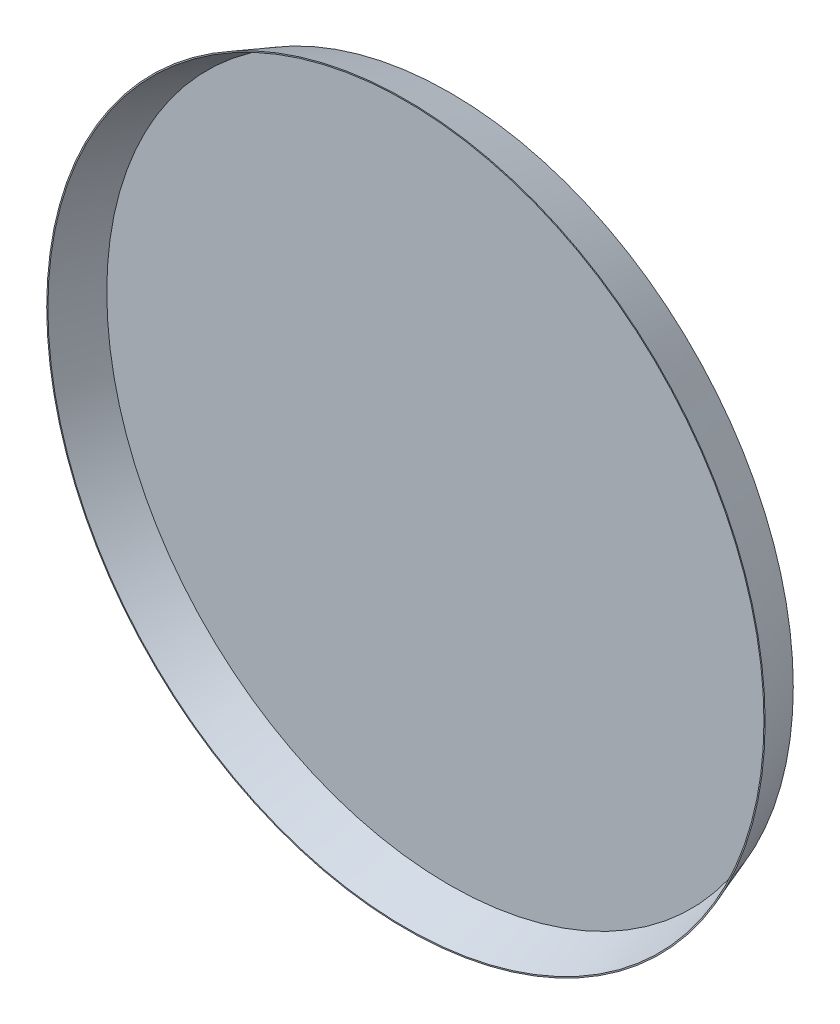
ISO-10303-21;
HEADER;
FILE_DESCRIPTION(('STEP AP214'),'2;1');
FILE_NAME('part.step','',(''),(''),'','','');
FILE_SCHEMA(('AUTOMOTIVE_DESIGN { 1 0 10303 214 1 1 1 1 }'));
ENDSEC;
DATA;
#1=APPLICATION_CONTEXT('core data for automotive mechanical design processes');
#2=APPLICATION_PROTOCOL_DEFINITION('international standard','automotive_design',2000,#1);
#3=PRODUCT_CONTEXT('',#1,'mechanical');
#4=PRODUCT('Part','Part','',(#3));
#5=PRODUCT_RELATED_PRODUCT_CATEGORY('part','',(#4));
#6=PRODUCT_DEFINITION_FORMATION('','',#4);
#7=PRODUCT_DEFINITION_CONTEXT('part definition',#1,'design');
#8=PRODUCT_DEFINITION('design','',#6,#7);
#9=PRODUCT_DEFINITION_SHAPE('','',#8);
#10=(LENGTH_UNIT() NAMED_UNIT(*) SI_UNIT(.MILLI.,.METRE.));
#11=(NAMED_UNIT(*) PLANE_ANGLE_UNIT() SI_UNIT($,.RADIAN.));
#12=(NAMED_UNIT(*) SI_UNIT($,.STERADIAN.) SOLID_ANGLE_UNIT());
#13=UNCERTAINTY_MEASURE_WITH_UNIT(LENGTH_MEASURE(1.E-05),#10,'distance_accuracy_value','');
#14=(GEOMETRIC_REPRESENTATION_CONTEXT(3) GLOBAL_UNCERTAINTY_ASSIGNED_CONTEXT((#13)) GLOBAL_UNIT_ASSIGNED_CONTEXT((#10,
#11,#12)) REPRESENTATION_CONTEXT('',''));
#15=CARTESIAN_POINT('',(0.,0.,0.));
#16=DIRECTION('',(0.,0.,1.));
#17=DIRECTION('',(1.,0.,0.));
#18=AXIS2_PLACEMENT_3D('',#15,#16,#17);
#19=CARTESIAN_POINT('',(0.,0.,0.));
#20=DIRECTION('',(0.,0.,1.));
#21=DIRECTION('',(1.,0.,0.));
#22=AXIS2_PLACEMENT_3D('',#19,#20,#21);
#23=CONICAL_SURFACE('',#22,15.5,0.349065850398867);
#24=CARTESIAN_POINT('',(0.,0.,2.));
#25=DIRECTION('',(0.,0.,1.));
#26=DIRECTION('',(1.,0.,0.));
#27=AXIS2_PLACEMENT_3D('',#24,#25,#26);
#28=CIRCLE('',#27,16.2279404685324);
#29=CARTESIAN_POINT('',(16.2279404685324,0.,2.));
#30=VERTEX_POINT('',#29);
#31=EDGE_CURVE('E10',#30,#30,#28,.T.);
#32=ORIENTED_EDGE('',*,*,#31,.F.);
#33=EDGE_LOOP('',(#32));
#34=FACE_BOUND('',#33,.T.);
#35=CARTESIAN_POINT('',(0.,0.,0.));
#36=DIRECTION('',(0.,0.,1.));
#37=DIRECTION('',(1.,0.,0.));
#38=AXIS2_PLACEMENT_3D('',#35,#36,#37);
#39=CIRCLE('',#38,15.5);
#40=CARTESIAN_POINT('',(15.5,0.,0.));
#41=VERTEX_POINT('',#40);
#42=EDGE_CURVE('E40',#41,#41,#39,.T.);
#43=ORIENTED_EDGE('',*,*,#42,.T.);
#44=EDGE_LOOP('',(#43));
#45=FACE_BOUND('',#44,.T.);
#46=ADVANCED_FACE('F34',(#34,#45),#23,.T.);
#47=CARTESIAN_POINT('',(0.,0.,2.));
#48=DIRECTION('',(0.,0.,1.));
#49=DIRECTION('',(1.,0.,0.));
#50=AXIS2_PLACEMENT_3D('',#47,#48,#49);
#51=PLANE('',#50);
#52=CARTESIAN_POINT('',(0.,0.,2.));
#53=DIRECTION('',(0.,0.,1.));
#54=DIRECTION('',(1.,0.,0.));
#55=AXIS2_PLACEMENT_3D('',#52,#53,#54);
#56=CIRCLE('',#55,16.1747315799086);
#57=CARTESIAN_POINT('',(16.1747315799086,0.,2.));
#58=VERTEX_POINT('',#57);
#59=EDGE_CURVE('E44',#58,#58,#56,.T.);
#60=ORIENTED_EDGE('',*,*,#59,.F.);
#61=EDGE_LOOP('',(#60));
#62=FACE_BOUND('',#61,.T.);
#63=ORIENTED_EDGE('',*,*,#31,.T.);
#64=EDGE_LOOP('',(#63));
#65=FACE_BOUND('',#64,.T.);
#66=ADVANCED_FACE('F66',(#62,#65),#51,.T.);
#67=CARTESIAN_POINT('',(0.,0.,0.));
#68=DIRECTION('',(0.,0.,1.));
#69=DIRECTION('',(1.,0.,0.));
#70=AXIS2_PLACEMENT_3D('',#67,#68,#69);
#71=PLANE('',#70);
#72=ORIENTED_EDGE('',*,*,#42,.F.);
#73=EDGE_LOOP('',(#72));
#74=FACE_BOUND('',#73,.T.);
#75=ADVANCED_FACE('F58',(#74),#71,.F.);
#76=CARTESIAN_POINT('',(0.,0.,0.0171010071662835));
#77=DIRECTION('',(0.,0.,1.));
#78=DIRECTION('',(1.,0.,0.));
#79=AXIS2_PLACEMENT_3D('',#76,#77,#78);
#80=CONICAL_SURFACE('',#79,15.4530153689607,0.349065850398867);
#81=ORIENTED_EDGE('',*,*,#59,.T.);
#82=EDGE_LOOP('',(#81));
#83=FACE_BOUND('',#82,.T.);
#84=CARTESIAN_POINT('',(0.,0.,0.05));
#85=DIRECTION('',(0.,0.,1.));
#86=DIRECTION('',(1.,0.,0.));
#87=AXIS2_PLACEMENT_3D('',#84,#85,#86);
#88=CIRCLE('',#87,15.4649896230895);
#89=CARTESIAN_POINT('',(15.4649896230895,0.,0.05));
#90=VERTEX_POINT('',#89);
#91=EDGE_CURVE('E48',#90,#90,#88,.T.);
#92=ORIENTED_EDGE('',*,*,#91,.F.);
#93=EDGE_LOOP('',(#92));
#94=FACE_BOUND('',#93,.T.);
#95=ADVANCED_FACE('F56',(#83,#94),#80,.F.);
#96=CARTESIAN_POINT('',(0.,0.,0.05));
#97=DIRECTION('',(0.,0.,1.));
#98=DIRECTION('',(1.,0.,0.));
#99=AXIS2_PLACEMENT_3D('',#96,#97,#98);
#100=PLANE('',#99);
#101=ORIENTED_EDGE('',*,*,#91,.T.);
#102=EDGE_LOOP('',(#101));
#103=FACE_BOUND('',#102,.T.);
#104=ADVANCED_FACE('F54',(#103),#100,.T.);
#105=CLOSED_SHELL('',(#46,#66,#75,#95,#104));
#106=MANIFOLD_SOLID_BREP('B2',#105);
#107=ADVANCED_BREP_SHAPE_REPRESENTATION('',(#18,#106),#14);
#108=SHAPE_DEFINITION_REPRESENTATION(#9,#107);
ENDSEC;
END-ISO-10303-21;
